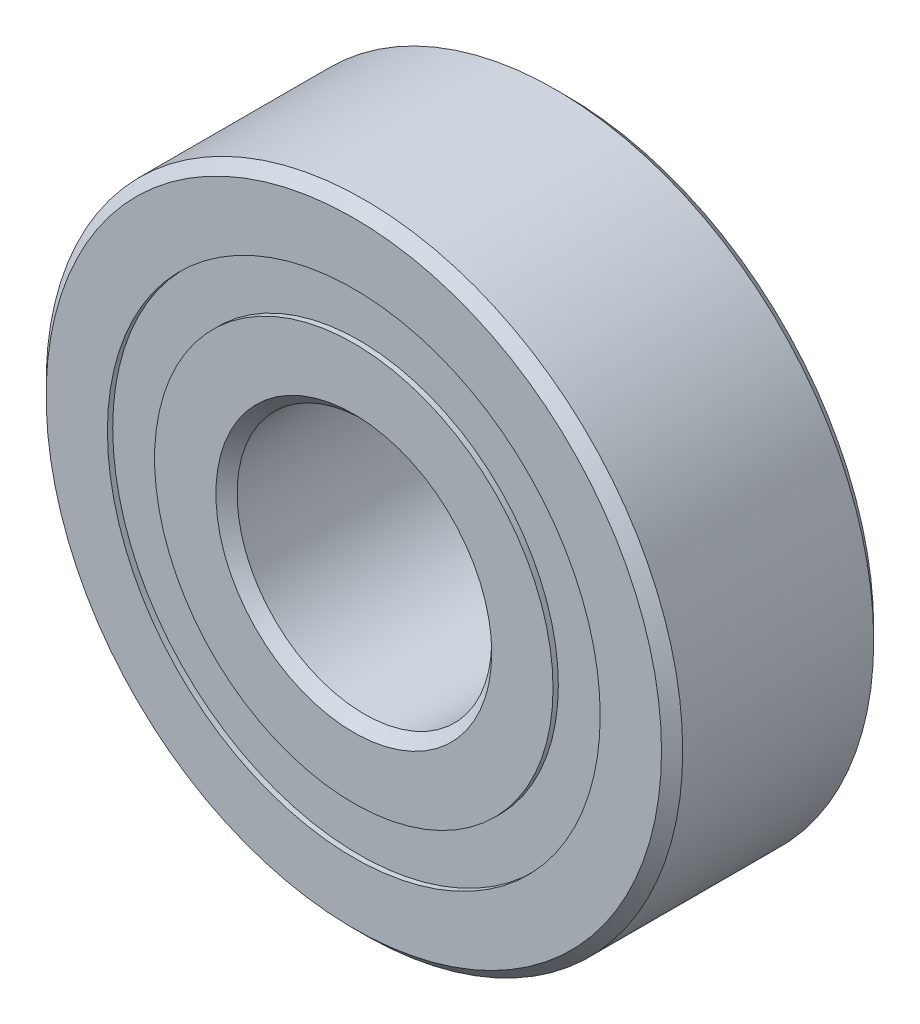
ISO-10303-21;
HEADER;
FILE_DESCRIPTION(('STEP AP214'),'2;1');
FILE_NAME('part.step','',(''),(''),'','','');
FILE_SCHEMA(('AUTOMOTIVE_DESIGN { 1 0 10303 214 1 1 1 1 }'));
ENDSEC;
DATA;
#1=APPLICATION_CONTEXT('core data for automotive mechanical design processes');
#2=APPLICATION_PROTOCOL_DEFINITION('international standard','automotive_design',2000,#1);
#3=PRODUCT_CONTEXT('',#1,'mechanical');
#4=PRODUCT('Part','Part','',(#3));
#5=PRODUCT_RELATED_PRODUCT_CATEGORY('part','',(#4));
#6=PRODUCT_DEFINITION_FORMATION('','',#4);
#7=PRODUCT_DEFINITION_CONTEXT('part definition',#1,'design');
#8=PRODUCT_DEFINITION('design','',#6,#7);
#9=PRODUCT_DEFINITION_SHAPE('','',#8);
#10=(LENGTH_UNIT() NAMED_UNIT(*) SI_UNIT(.MILLI.,.METRE.));
#11=(NAMED_UNIT(*) PLANE_ANGLE_UNIT() SI_UNIT($,.RADIAN.));
#12=(NAMED_UNIT(*) SI_UNIT($,.STERADIAN.) SOLID_ANGLE_UNIT());
#13=UNCERTAINTY_MEASURE_WITH_UNIT(LENGTH_MEASURE(1.E-05),#10,'distance_accuracy_value','');
#14=(GEOMETRIC_REPRESENTATION_CONTEXT(3) GLOBAL_UNCERTAINTY_ASSIGNED_CONTEXT((#13)) GLOBAL_UNIT_ASSIGNED_CONTEXT((#10,
#11,#12)) REPRESENTATION_CONTEXT('',''));
#15=CARTESIAN_POINT('',(0.,0.,0.));
#16=DIRECTION('',(0.,0.,1.));
#17=DIRECTION('',(1.,0.,0.));
#18=AXIS2_PLACEMENT_3D('',#15,#16,#17);
#19=CARTESIAN_POINT('',(0.,5.80555555555555,-1.24225998749989));
#20=DIRECTION('',(0.,0.,-1.));
#21=DIRECTION('',(-1.,0.,0.));
#22=AXIS2_PLACEMENT_3D('',#19,#20,#21);
#23=PLANE('',#22);
#24=CARTESIAN_POINT('',(0.,0.,-1.24225998749989));
#25=DIRECTION('',(0.,0.,1.));
#26=DIRECTION('',(1.,0.,0.));
#27=AXIS2_PLACEMENT_3D('',#24,#25,#26);
#28=CIRCLE('',#27,4.69444444444445);
#29=CARTESIAN_POINT('',(4.69444444444445,0.,-1.24225998749989));
#30=VERTEX_POINT('',#29);
#31=EDGE_CURVE('E11',#30,#30,#28,.T.);
#32=ORIENTED_EDGE('',*,*,#31,.F.);
#33=EDGE_LOOP('',(#32));
#34=FACE_BOUND('',#33,.T.);
#35=CARTESIAN_POINT('',(0.,0.,-1.24225998749988));
#36=DIRECTION('',(0.,0.,1.));
#37=DIRECTION('',(1.,0.,0.));
#38=AXIS2_PLACEMENT_3D('',#35,#36,#37);
#39=CIRCLE('',#38,5.80555555555555);
#40=CARTESIAN_POINT('',(5.80555555555555,0.,-1.24225998749988));
#41=VERTEX_POINT('',#40);
#42=EDGE_CURVE('E58',#41,#41,#39,.T.);
#43=ORIENTED_EDGE('',*,*,#42,.T.);
#44=EDGE_LOOP('',(#43));
#45=FACE_BOUND('',#44,.T.);
#46=ADVANCED_FACE('F44',(#34,#45),#23,.F.);
#47=CARTESIAN_POINT('',(0.,0.,2.5));
#48=DIRECTION('',(0.,0.,1.));
#49=DIRECTION('',(1.,0.,0.));
#50=AXIS2_PLACEMENT_3D('',#47,#48,#49);
#51=CYLINDRICAL_SURFACE('',#50,4.69444444444445);
#52=CARTESIAN_POINT('',(0.,0.,-2.375));
#53=DIRECTION('',(0.,0.,1.));
#54=DIRECTION('',(1.,0.,0.));
#55=AXIS2_PLACEMENT_3D('',#52,#53,#54);
#56=CIRCLE('',#55,4.69444444444445);
#57=CARTESIAN_POINT('',(4.69444444444445,0.,-2.375));
#58=VERTEX_POINT('',#57);
#59=EDGE_CURVE('E50',#58,#58,#56,.T.);
#60=ORIENTED_EDGE('',*,*,#59,.F.);
#61=EDGE_LOOP('',(#60));
#62=FACE_BOUND('',#61,.T.);
#63=ORIENTED_EDGE('',*,*,#31,.T.);
#64=EDGE_LOOP('',(#63));
#65=FACE_BOUND('',#64,.T.);
#66=ADVANCED_FACE('F73',(#62,#65),#51,.F.);
#67=CARTESIAN_POINT('',(0.,5.80555555555555,-2.375));
#68=DIRECTION('',(0.,0.,1.));
#69=DIRECTION('',(1.,0.,0.));
#70=AXIS2_PLACEMENT_3D('',#67,#68,#69);
#71=PLANE('',#70);
#72=CARTESIAN_POINT('',(0.,0.,-2.375));
#73=DIRECTION('',(0.,0.,1.));
#74=DIRECTION('',(1.,0.,0.));
#75=AXIS2_PLACEMENT_3D('',#72,#73,#74);
#76=CIRCLE('',#75,5.80555555555555);
#77=CARTESIAN_POINT('',(5.80555555555555,0.,-2.375));
#78=VERTEX_POINT('',#77);
#79=EDGE_CURVE('E54',#78,#78,#76,.T.);
#80=ORIENTED_EDGE('',*,*,#79,.F.);
#81=EDGE_LOOP('',(#80));
#82=FACE_BOUND('',#81,.T.);
#83=ORIENTED_EDGE('',*,*,#59,.T.);
#84=EDGE_LOOP('',(#83));
#85=FACE_BOUND('',#84,.T.);
#86=ADVANCED_FACE('F68',(#82,#85),#71,.F.);
#87=CARTESIAN_POINT('',(0.,0.,2.5));
#88=DIRECTION('',(0.,0.,1.));
#89=DIRECTION('',(1.,0.,0.));
#90=AXIS2_PLACEMENT_3D('',#87,#88,#89);
#91=CYLINDRICAL_SURFACE('',#90,5.80555555555555);
#92=ORIENTED_EDGE('',*,*,#42,.F.);
#93=EDGE_LOOP('',(#92));
#94=FACE_BOUND('',#93,.T.);
#95=ORIENTED_EDGE('',*,*,#79,.T.);
#96=EDGE_LOOP('',(#95));
#97=FACE_BOUND('',#96,.T.);
#98=ADVANCED_FACE('F65',(#94,#97),#91,.T.);
#99=CLOSED_SHELL('',(#46,#66,#86,#98));
#100=MANIFOLD_SOLID_BREP('B2',#99);
#101=CARTESIAN_POINT('',(0.,5.80555555555555,2.375));
#102=DIRECTION('',(0.,0.,-1.));
#103=DIRECTION('',(-1.,0.,0.));
#104=AXIS2_PLACEMENT_3D('',#101,#102,#103);
#105=PLANE('',#104);
#106=CARTESIAN_POINT('',(0.,0.,2.375));
#107=DIRECTION('',(0.,0.,1.));
#108=DIRECTION('',(1.,0.,0.));
#109=AXIS2_PLACEMENT_3D('',#106,#107,#108);
#110=CIRCLE('',#109,4.69444444444445);
#111=CARTESIAN_POINT('',(4.69444444444445,0.,2.375));
#112=VERTEX_POINT('',#111);
#113=EDGE_CURVE('E43',#112,#112,#110,.T.);
#114=ORIENTED_EDGE('',*,*,#113,.F.);
#115=EDGE_LOOP('',(#114));
#116=FACE_BOUND('',#115,.T.);
#117=CARTESIAN_POINT('',(0.,0.,2.375));
#118=DIRECTION('',(0.,0.,1.));
#119=DIRECTION('',(1.,0.,0.));
#120=AXIS2_PLACEMENT_3D('',#117,#118,#119);
#121=CIRCLE('',#120,5.80555555555555);
#122=CARTESIAN_POINT('',(5.80555555555555,0.,2.375));
#123=VERTEX_POINT('',#122);
#124=EDGE_CURVE('E126',#123,#123,#121,.T.);
#125=ORIENTED_EDGE('',*,*,#124,.T.);
#126=EDGE_LOOP('',(#125));
#127=FACE_BOUND('',#126,.T.);
#128=ADVANCED_FACE('F112',(#116,#127),#105,.F.);
#129=CARTESIAN_POINT('',(0.,0.,2.5));
#130=DIRECTION('',(0.,0.,1.));
#131=DIRECTION('',(1.,0.,0.));
#132=AXIS2_PLACEMENT_3D('',#129,#130,#131);
#133=CYLINDRICAL_SURFACE('',#132,4.69444444444445);
#134=CARTESIAN_POINT('',(0.,0.,1.24225998749988));
#135=DIRECTION('',(0.,0.,1.));
#136=DIRECTION('',(1.,0.,0.));
#137=AXIS2_PLACEMENT_3D('',#134,#135,#136);
#138=CIRCLE('',#137,4.69444444444445);
#139=CARTESIAN_POINT('',(4.69444444444445,0.,1.24225998749988));
#140=VERTEX_POINT('',#139);
#141=EDGE_CURVE('E118',#140,#140,#138,.T.);
#142=ORIENTED_EDGE('',*,*,#141,.F.);
#143=EDGE_LOOP('',(#142));
#144=FACE_BOUND('',#143,.T.);
#145=ORIENTED_EDGE('',*,*,#113,.T.);
#146=EDGE_LOOP('',(#145));
#147=FACE_BOUND('',#146,.T.);
#148=ADVANCED_FACE('F141',(#144,#147),#133,.F.);
#149=CARTESIAN_POINT('',(0.,5.80555555555555,1.24225998749988));
#150=DIRECTION('',(0.,0.,1.));
#151=DIRECTION('',(1.,0.,0.));
#152=AXIS2_PLACEMENT_3D('',#149,#150,#151);
#153=PLANE('',#152);
#154=CARTESIAN_POINT('',(0.,0.,1.24225998749988));
#155=DIRECTION('',(0.,0.,1.));
#156=DIRECTION('',(1.,0.,0.));
#157=AXIS2_PLACEMENT_3D('',#154,#155,#156);
#158=CIRCLE('',#157,5.80555555555555);
#159=CARTESIAN_POINT('',(5.80555555555555,0.,1.24225998749988));
#160=VERTEX_POINT('',#159);
#161=EDGE_CURVE('E122',#160,#160,#158,.T.);
#162=ORIENTED_EDGE('',*,*,#161,.F.);
#163=EDGE_LOOP('',(#162));
#164=FACE_BOUND('',#163,.T.);
#165=ORIENTED_EDGE('',*,*,#141,.T.);
#166=EDGE_LOOP('',(#165));
#167=FACE_BOUND('',#166,.T.);
#168=ADVANCED_FACE('F136',(#164,#167),#153,.F.);
#169=CARTESIAN_POINT('',(0.,0.,2.5));
#170=DIRECTION('',(0.,0.,1.));
#171=DIRECTION('',(1.,0.,0.));
#172=AXIS2_PLACEMENT_3D('',#169,#170,#171);
#173=CYLINDRICAL_SURFACE('',#172,5.80555555555555);
#174=ORIENTED_EDGE('',*,*,#124,.F.);
#175=EDGE_LOOP('',(#174));
#176=FACE_BOUND('',#175,.T.);
#177=ORIENTED_EDGE('',*,*,#161,.T.);
#178=EDGE_LOOP('',(#177));
#179=FACE_BOUND('',#178,.T.);
#180=ADVANCED_FACE('F133',(#176,#179),#173,.T.);
#181=CLOSED_SHELL('',(#128,#148,#168,#180));
#182=MANIFOLD_SOLID_BREP('B6',#181);
#183=CARTESIAN_POINT('',(-2.62499999999994,4.54663336986834,0.));
#184=DIRECTION('',(0.,0.,1.));
#185=DIRECTION('',(-0.499999999999989,0.866025403784445,0.));
#186=AXIS2_PLACEMENT_3D('',#183,#184,#185);
#187=SPHERICAL_SURFACE('',#186,1.24225998749988);
#188=CARTESIAN_POINT('',(-2.62499999999994,4.54663336986834,1.24225998749987));
#189=VERTEX_POINT('',#188);
#190=VERTEX_LOOP('',#189);
#191=FACE_BOUND('',#190,.T.);
#192=ADVANCED_FACE('F180',(#191),#187,.T.);
#193=CLOSED_SHELL('',(#192));
#194=MANIFOLD_SOLID_BREP('B38',#193);
#195=CARTESIAN_POINT('',(-4.54663336986827,2.62500000000005,0.));
#196=DIRECTION('',(0.,0.,1.));
#197=DIRECTION('',(-0.866025403784433,0.50000000000001,0.));
#198=AXIS2_PLACEMENT_3D('',#195,#196,#197);
#199=SPHERICAL_SURFACE('',#198,1.24225998749988);
#200=CARTESIAN_POINT('',(-4.54663336986827,2.62500000000005,1.24225998749987));
#201=VERTEX_POINT('',#200);
#202=VERTEX_LOOP('',#201);
#203=FACE_BOUND('',#202,.T.);
#204=ADVANCED_FACE('F213',(#203),#199,.T.);
#205=CLOSED_SHELL('',(#204));
#206=MANIFOLD_SOLID_BREP('B108',#205);
#207=CARTESIAN_POINT('',(-5.25,0.,0.));
#208=DIRECTION('',(0.,0.,1.));
#209=DIRECTION('',(-1.,0.,0.));
#210=AXIS2_PLACEMENT_3D('',#207,#208,#209);
#211=SPHERICAL_SURFACE('',#210,1.24225998749988);
#212=CARTESIAN_POINT('',(-5.25,0.,1.24225998749987));
#213=VERTEX_POINT('',#212);
#214=VERTEX_LOOP('',#213);
#215=FACE_BOUND('',#214,.T.);
#216=ADVANCED_FACE('F246',(#215),#211,.T.);
#217=CLOSED_SHELL('',(#216));
#218=MANIFOLD_SOLID_BREP('B176',#217);
#219=CARTESIAN_POINT('',(-4.54663336986833,-2.62499999999996,0.));
#220=DIRECTION('',(0.,0.,1.));
#221=DIRECTION('',(-0.866025403784443,-0.499999999999992,0.));
#222=AXIS2_PLACEMENT_3D('',#219,#220,#221);
#223=SPHERICAL_SURFACE('',#222,1.24225998749988);
#224=CARTESIAN_POINT('',(-4.54663336986833,-2.62499999999996,1.24225998749987));
#225=VERTEX_POINT('',#224);
#226=VERTEX_LOOP('',#225);
#227=FACE_BOUND('',#226,.T.);
#228=ADVANCED_FACE('F279',(#227),#223,.T.);
#229=CLOSED_SHELL('',(#228));
#230=MANIFOLD_SOLID_BREP('B209',#229);
#231=CARTESIAN_POINT('',(-2.62500000000004,-4.54663336986828,0.));
#232=DIRECTION('',(0.,0.,1.));
#233=DIRECTION('',(-0.500000000000007,-0.866025403784435,0.));
#234=AXIS2_PLACEMENT_3D('',#231,#232,#233);
#235=SPHERICAL_SURFACE('',#234,1.24225998749988);
#236=CARTESIAN_POINT('',(-2.62500000000004,-4.54663336986828,1.24225998749987));
#237=VERTEX_POINT('',#236);
#238=VERTEX_LOOP('',#237);
#239=FACE_BOUND('',#238,.T.);
#240=ADVANCED_FACE('F312',(#239),#235,.T.);
#241=CLOSED_SHELL('',(#240));
#242=MANIFOLD_SOLID_BREP('B242',#241);
#243=CARTESIAN_POINT('',(0.,-5.25,0.));
#244=DIRECTION('',(0.,0.,1.));
#245=DIRECTION('',(0.,-1.,0.));
#246=AXIS2_PLACEMENT_3D('',#243,#244,#245);
#247=SPHERICAL_SURFACE('',#246,1.24225998749988);
#248=CARTESIAN_POINT('',(0.,-5.25,1.24225998749987));
#249=VERTEX_POINT('',#248);
#250=VERTEX_LOOP('',#249);
#251=FACE_BOUND('',#250,.T.);
#252=ADVANCED_FACE('F345',(#251),#247,.T.);
#253=CLOSED_SHELL('',(#252));
#254=MANIFOLD_SOLID_BREP('B275',#253);
#255=CARTESIAN_POINT('',(2.62499999999997,-4.54663336986832,0.));
#256=DIRECTION('',(0.,0.,1.));
#257=DIRECTION('',(0.499999999999995,-0.866025403784442,0.));
#258=AXIS2_PLACEMENT_3D('',#255,#256,#257);
#259=SPHERICAL_SURFACE('',#258,1.24225998749988);
#260=CARTESIAN_POINT('',(2.62499999999997,-4.54663336986832,1.24225998749987));
#261=VERTEX_POINT('',#260);
#262=VERTEX_LOOP('',#261);
#263=FACE_BOUND('',#262,.T.);
#264=ADVANCED_FACE('F378',(#263),#259,.T.);
#265=CLOSED_SHELL('',(#264));
#266=MANIFOLD_SOLID_BREP('B308',#265);
#267=CARTESIAN_POINT('',(4.54663336986829,-2.62500000000002,0.));
#268=DIRECTION('',(0.,0.,1.));
#269=DIRECTION('',(0.866025403784436,-0.500000000000004,0.));
#270=AXIS2_PLACEMENT_3D('',#267,#268,#269);
#271=SPHERICAL_SURFACE('',#270,1.24225998749988);
#272=CARTESIAN_POINT('',(4.54663336986829,-2.62500000000002,1.24225998749987));
#273=VERTEX_POINT('',#272);
#274=VERTEX_LOOP('',#273);
#275=FACE_BOUND('',#274,.T.);
#276=ADVANCED_FACE('F411',(#275),#271,.T.);
#277=CLOSED_SHELL('',(#276));
#278=MANIFOLD_SOLID_BREP('B341',#277);
#279=CARTESIAN_POINT('',(5.25,0.,0.));
#280=DIRECTION('',(0.,0.,1.));
#281=DIRECTION('',(1.,0.,0.));
#282=AXIS2_PLACEMENT_3D('',#279,#280,#281);
#283=SPHERICAL_SURFACE('',#282,1.24225998749988);
#284=CARTESIAN_POINT('',(5.25,0.,1.24225998749987));
#285=VERTEX_POINT('',#284);
#286=VERTEX_LOOP('',#285);
#287=FACE_BOUND('',#286,.T.);
#288=ADVANCED_FACE('F444',(#287),#283,.T.);
#289=CLOSED_SHELL('',(#288));
#290=MANIFOLD_SOLID_BREP('B374',#289);
#291=CARTESIAN_POINT('',(4.54663336986831,2.62499999999999,0.));
#292=DIRECTION('',(0.,0.,1.));
#293=DIRECTION('',(0.86602540378444,0.499999999999998,0.));
#294=AXIS2_PLACEMENT_3D('',#291,#292,#293);
#295=SPHERICAL_SURFACE('',#294,1.24225998749988);
#296=CARTESIAN_POINT('',(4.54663336986831,2.62499999999999,1.24225998749987));
#297=VERTEX_POINT('',#296);
#298=VERTEX_LOOP('',#297);
#299=FACE_BOUND('',#298,.T.);
#300=ADVANCED_FACE('F477',(#299),#295,.T.);
#301=CLOSED_SHELL('',(#300));
#302=MANIFOLD_SOLID_BREP('B407',#301);
#303=CARTESIAN_POINT('',(2.62500000000001,4.5466333698683,0.));
#304=DIRECTION('',(0.,0.,1.));
#305=DIRECTION('',(0.500000000000001,0.866025403784438,0.));
#306=AXIS2_PLACEMENT_3D('',#303,#304,#305);
#307=SPHERICAL_SURFACE('',#306,1.24225998749988);
#308=CARTESIAN_POINT('',(2.62500000000001,4.5466333698683,1.24225998749987));
#309=VERTEX_POINT('',#308);
#310=VERTEX_LOOP('',#309);
#311=FACE_BOUND('',#310,.T.);
#312=ADVANCED_FACE('F510',(#311),#307,.T.);
#313=CLOSED_SHELL('',(#312));
#314=MANIFOLD_SOLID_BREP('B440',#313);
#315=CARTESIAN_POINT('',(0.,5.25,0.));
#316=DIRECTION('',(0.,0.,1.));
#317=DIRECTION('',(0.,1.,0.));
#318=AXIS2_PLACEMENT_3D('',#315,#316,#317);
#319=SPHERICAL_SURFACE('',#318,1.24225998749988);
#320=CARTESIAN_POINT('',(0.,5.25,1.24225998749987));
#321=VERTEX_POINT('',#320);
#322=VERTEX_LOOP('',#321);
#323=FACE_BOUND('',#322,.T.);
#324=ADVANCED_FACE('F545',(#323),#319,.T.);
#325=CLOSED_SHELL('',(#324));
#326=MANIFOLD_SOLID_BREP('B473',#325);
#327=CARTESIAN_POINT('',(0.,4.69444444444445,2.5));
#328=DIRECTION('',(0.,0.,-1.));
#329=DIRECTION('',(-1.,0.,0.));
#330=AXIS2_PLACEMENT_3D('',#327,#328,#329);
#331=PLANE('',#330);
#332=CARTESIAN_POINT('',(0.,0.,2.5));
#333=DIRECTION('',(0.,0.,1.));
#334=DIRECTION('',(1.,0.,0.));
#335=AXIS2_PLACEMENT_3D('',#332,#333,#334);
#336=CIRCLE('',#335,3.25);
#337=CARTESIAN_POINT('',(3.25,0.,2.5));
#338=VERTEX_POINT('',#337);
#339=EDGE_CURVE('E544',#338,#338,#336,.T.);
#340=ORIENTED_EDGE('',*,*,#339,.F.);
#341=EDGE_LOOP('',(#340));
#342=FACE_BOUND('',#341,.T.);
#343=CARTESIAN_POINT('',(0.,0.,2.5));
#344=DIRECTION('',(0.,0.,1.));
#345=DIRECTION('',(1.,0.,0.));
#346=AXIS2_PLACEMENT_3D('',#343,#344,#345);
#347=CIRCLE('',#346,4.69444444444445);
#348=CARTESIAN_POINT('',(4.69444444444445,0.,2.5));
#349=VERTEX_POINT('',#348);
#350=EDGE_CURVE('E593',#349,#349,#347,.T.);
#351=ORIENTED_EDGE('',*,*,#350,.T.);
#352=EDGE_LOOP('',(#351));
#353=FACE_BOUND('',#352,.T.);
#354=ADVANCED_FACE('F565',(#342,#353),#331,.F.);
#355=CARTESIAN_POINT('',(0.,0.,2.5));
#356=DIRECTION('',(0.,0.,1.));
#357=DIRECTION('',(1.,0.,0.));
#358=AXIS2_PLACEMENT_3D('',#355,#356,#357);
#359=CONICAL_SURFACE('',#358,3.25,0.785398163397445);
#360=CARTESIAN_POINT('',(0.,0.,2.25));
#361=DIRECTION('',(0.,0.,1.));
#362=DIRECTION('',(1.,0.,0.));
#363=AXIS2_PLACEMENT_3D('',#360,#361,#362);
#364=CIRCLE('',#363,3.);
#365=CARTESIAN_POINT('',(3.,0.,2.25));
#366=VERTEX_POINT('',#365);
#367=EDGE_CURVE('E571',#366,#366,#364,.T.);
#368=ORIENTED_EDGE('',*,*,#367,.F.);
#369=EDGE_LOOP('',(#368));
#370=FACE_BOUND('',#369,.T.);
#371=ORIENTED_EDGE('',*,*,#339,.T.);
#372=EDGE_LOOP('',(#371));
#373=FACE_BOUND('',#372,.T.);
#374=ADVANCED_FACE('F630',(#370,#373),#359,.F.);
#375=CARTESIAN_POINT('',(0.,0.,2.5));
#376=DIRECTION('',(0.,0.,1.));
#377=DIRECTION('',(1.,0.,0.));
#378=AXIS2_PLACEMENT_3D('',#375,#376,#377);
#379=CYLINDRICAL_SURFACE('',#378,3.);
#380=CARTESIAN_POINT('',(0.,0.,-2.25));
#381=DIRECTION('',(0.,0.,1.));
#382=DIRECTION('',(1.,0.,0.));
#383=AXIS2_PLACEMENT_3D('',#380,#381,#382);
#384=CIRCLE('',#383,3.);
#385=CARTESIAN_POINT('',(3.,0.,-2.25));
#386=VERTEX_POINT('',#385);
#387=EDGE_CURVE('E575',#386,#386,#384,.T.);
#388=ORIENTED_EDGE('',*,*,#387,.F.);
#389=EDGE_LOOP('',(#388));
#390=FACE_BOUND('',#389,.T.);
#391=ORIENTED_EDGE('',*,*,#367,.T.);
#392=EDGE_LOOP('',(#391));
#393=FACE_BOUND('',#392,.T.);
#394=ADVANCED_FACE('F625',(#390,#393),#379,.F.);
#395=CARTESIAN_POINT('',(0.,0.,-2.25));
#396=DIRECTION('',(0.,0.,-1.));
#397=DIRECTION('',(-1.,0.,0.));
#398=AXIS2_PLACEMENT_3D('',#395,#396,#397);
#399=CONICAL_SURFACE('',#398,3.,0.785398163397445);
#400=CARTESIAN_POINT('',(0.,0.,-2.5));
#401=DIRECTION('',(0.,0.,1.));
#402=DIRECTION('',(1.,0.,0.));
#403=AXIS2_PLACEMENT_3D('',#400,#401,#402);
#404=CIRCLE('',#403,3.25);
#405=CARTESIAN_POINT('',(3.25,0.,-2.5));
#406=VERTEX_POINT('',#405);
#407=EDGE_CURVE('E579',#406,#406,#404,.T.);
#408=ORIENTED_EDGE('',*,*,#407,.F.);
#409=EDGE_LOOP('',(#408));
#410=FACE_BOUND('',#409,.T.);
#411=ORIENTED_EDGE('',*,*,#387,.T.);
#412=EDGE_LOOP('',(#411));
#413=FACE_BOUND('',#412,.T.);
#414=ADVANCED_FACE('F619',(#410,#413),#399,.F.);
#415=CARTESIAN_POINT('',(0.,4.69444444444445,-2.5));
#416=DIRECTION('',(0.,0.,1.));
#417=DIRECTION('',(1.,0.,0.));
#418=AXIS2_PLACEMENT_3D('',#415,#416,#417);
#419=PLANE('',#418);
#420=CARTESIAN_POINT('',(0.,0.,-2.50000000000001));
#421=DIRECTION('',(0.,0.,1.));
#422=DIRECTION('',(1.,0.,0.));
#423=AXIS2_PLACEMENT_3D('',#420,#421,#422);
#424=CIRCLE('',#423,4.69444444444445);
#425=CARTESIAN_POINT('',(4.69444444444445,0.,-2.50000000000001));
#426=VERTEX_POINT('',#425);
#427=EDGE_CURVE('E584',#426,#426,#424,.T.);
#428=ORIENTED_EDGE('',*,*,#427,.F.);
#429=EDGE_LOOP('',(#428));
#430=FACE_BOUND('',#429,.T.);
#431=ORIENTED_EDGE('',*,*,#407,.T.);
#432=EDGE_LOOP('',(#431));
#433=FACE_BOUND('',#432,.T.);
#434=ADVANCED_FACE('F613',(#430,#433),#419,.F.);
#435=CARTESIAN_POINT('',(0.,0.,2.5));
#436=DIRECTION('',(0.,0.,1.));
#437=DIRECTION('',(1.,0.,0.));
#438=AXIS2_PLACEMENT_3D('',#435,#436,#437);
#439=CYLINDRICAL_SURFACE('',#438,4.69444444444445);
#440=CARTESIAN_POINT('',(0.,0.,-1.11111111111111));
#441=DIRECTION('',(0.,0.,1.));
#442=DIRECTION('',(1.,0.,0.));
#443=AXIS2_PLACEMENT_3D('',#440,#441,#442);
#444=CIRCLE('',#443,4.69444444444445);
#445=CARTESIAN_POINT('',(4.69444444444445,0.,-1.11111111111111));
#446=VERTEX_POINT('',#445);
#447=EDGE_CURVE('E587',#446,#446,#444,.T.);
#448=ORIENTED_EDGE('',*,*,#447,.F.);
#449=EDGE_LOOP('',(#448));
#450=FACE_BOUND('',#449,.T.);
#451=ORIENTED_EDGE('',*,*,#427,.T.);
#452=EDGE_LOOP('',(#451));
#453=FACE_BOUND('',#452,.T.);
#454=ADVANCED_FACE('F607',(#450,#453),#439,.T.);
#455=CARTESIAN_POINT('',(0.,0.,0.));
#456=DIRECTION('',(0.,0.,1.));
#457=DIRECTION('',(1.,0.,0.));
#458=AXIS2_PLACEMENT_3D('',#455,#456,#457);
#459=TOROIDAL_SURFACE('',#458,5.25,1.24225998749988);
#460=CARTESIAN_POINT('',(0.,0.,1.11111111111111));
#461=DIRECTION('',(0.,0.,1.));
#462=DIRECTION('',(1.,0.,0.));
#463=AXIS2_PLACEMENT_3D('',#460,#461,#462);
#464=CIRCLE('',#463,4.69444444444445);
#465=CARTESIAN_POINT('',(4.69444444444445,0.,1.11111111111111));
#466=VERTEX_POINT('',#465);
#467=EDGE_CURVE('E590',#466,#466,#464,.T.);
#468=ORIENTED_EDGE('',*,*,#467,.F.);
#469=EDGE_LOOP('',(#468));
#470=FACE_BOUND('',#469,.T.);
#471=ORIENTED_EDGE('',*,*,#447,.T.);
#472=EDGE_LOOP('',(#471));
#473=FACE_BOUND('',#472,.T.);
#474=ADVANCED_FACE('F601',(#470,#473),#459,.F.);
#475=CARTESIAN_POINT('',(0.,0.,2.5));
#476=DIRECTION('',(0.,0.,1.));
#477=DIRECTION('',(1.,0.,0.));
#478=AXIS2_PLACEMENT_3D('',#475,#476,#477);
#479=CYLINDRICAL_SURFACE('',#478,4.69444444444445);
#480=ORIENTED_EDGE('',*,*,#350,.F.);
#481=EDGE_LOOP('',(#480));
#482=FACE_BOUND('',#481,.T.);
#483=ORIENTED_EDGE('',*,*,#467,.T.);
#484=EDGE_LOOP('',(#483));
#485=FACE_BOUND('',#484,.T.);
#486=ADVANCED_FACE('F598',(#482,#485),#479,.T.);
#487=CLOSED_SHELL('',(#354,#374,#394,#414,#434,#454,#474,#486));
#488=MANIFOLD_SOLID_BREP('B506',#487);
#489=CARTESIAN_POINT('',(0.,0.,2.25));
#490=DIRECTION('',(0.,0.,-1.));
#491=DIRECTION('',(-1.,0.,0.));
#492=AXIS2_PLACEMENT_3D('',#489,#490,#491);
#493=CONICAL_SURFACE('',#492,7.5,0.785398163397448);
#494=CARTESIAN_POINT('',(0.,0.,2.5));
#495=DIRECTION('',(0.,0.,1.));
#496=DIRECTION('',(1.,0.,0.));
#497=AXIS2_PLACEMENT_3D('',#494,#495,#496);
#498=CIRCLE('',#497,7.25);
#499=CARTESIAN_POINT('',(7.25,0.,2.5));
#500=VERTEX_POINT('',#499);
#501=EDGE_CURVE('E715',#500,#500,#498,.T.);
#502=ORIENTED_EDGE('',*,*,#501,.F.);
#503=EDGE_LOOP('',(#502));
#504=FACE_BOUND('',#503,.T.);
#505=CARTESIAN_POINT('',(0.,0.,2.25));
#506=DIRECTION('',(0.,0.,1.));
#507=DIRECTION('',(1.,0.,0.));
#508=AXIS2_PLACEMENT_3D('',#505,#506,#507);
#509=CIRCLE('',#508,7.5);
#510=CARTESIAN_POINT('',(7.5,0.,2.25));
#511=VERTEX_POINT('',#510);
#512=EDGE_CURVE('E564',#511,#511,#509,.T.);
#513=ORIENTED_EDGE('',*,*,#512,.T.);
#514=EDGE_LOOP('',(#513));
#515=FACE_BOUND('',#514,.T.);
#516=ADVANCED_FACE('F687',(#504,#515),#493,.T.);
#517=CARTESIAN_POINT('',(0.,0.,2.5));
#518=DIRECTION('',(0.,0.,1.));
#519=DIRECTION('',(1.,0.,0.));
#520=AXIS2_PLACEMENT_3D('',#517,#518,#519);
#521=CYLINDRICAL_SURFACE('',#520,7.5);
#522=ORIENTED_EDGE('',*,*,#512,.F.);
#523=EDGE_LOOP('',(#522));
#524=FACE_BOUND('',#523,.T.);
#525=CARTESIAN_POINT('',(0.,0.,-2.25000000000001));
#526=DIRECTION('',(0.,0.,1.));
#527=DIRECTION('',(1.,0.,0.));
#528=AXIS2_PLACEMENT_3D('',#525,#526,#527);
#529=CIRCLE('',#528,7.5);
#530=CARTESIAN_POINT('',(7.5,0.,-2.25000000000001));
#531=VERTEX_POINT('',#530);
#532=EDGE_CURVE('E693',#531,#531,#529,.T.);
#533=ORIENTED_EDGE('',*,*,#532,.T.);
#534=EDGE_LOOP('',(#533));
#535=FACE_BOUND('',#534,.T.);
#536=ADVANCED_FACE('F722',(#524,#535),#521,.T.);
#537=CARTESIAN_POINT('',(0.,0.,-2.50000000000001));
#538=DIRECTION('',(0.,0.,1.));
#539=DIRECTION('',(1.,0.,0.));
#540=AXIS2_PLACEMENT_3D('',#537,#538,#539);
#541=CONICAL_SURFACE('',#540,7.25,0.785398163397448);
#542=ORIENTED_EDGE('',*,*,#532,.F.);
#543=EDGE_LOOP('',(#542));
#544=FACE_BOUND('',#543,.T.);
#545=CARTESIAN_POINT('',(0.,0.,-2.50000000000001));
#546=DIRECTION('',(0.,0.,1.));
#547=DIRECTION('',(1.,0.,0.));
#548=AXIS2_PLACEMENT_3D('',#545,#546,#547);
#549=CIRCLE('',#548,7.25);
#550=CARTESIAN_POINT('',(7.25,0.,-2.50000000000001));
#551=VERTEX_POINT('',#550);
#552=EDGE_CURVE('E697',#551,#551,#549,.T.);
#553=ORIENTED_EDGE('',*,*,#552,.T.);
#554=EDGE_LOOP('',(#553));
#555=FACE_BOUND('',#554,.T.);
#556=ADVANCED_FACE('F726',(#544,#555),#541,.T.);
#557=CARTESIAN_POINT('',(0.,7.25,-2.50000000000001));
#558=DIRECTION('',(0.,0.,1.));
#559=DIRECTION('',(1.,0.,0.));
#560=AXIS2_PLACEMENT_3D('',#557,#558,#559);
#561=PLANE('',#560);
#562=ORIENTED_EDGE('',*,*,#552,.F.);
#563=EDGE_LOOP('',(#562));
#564=FACE_BOUND('',#563,.T.);
#565=CARTESIAN_POINT('',(0.,0.,-2.50000000000001));
#566=DIRECTION('',(0.,0.,1.));
#567=DIRECTION('',(1.,0.,0.));
#568=AXIS2_PLACEMENT_3D('',#565,#566,#567);
#569=CIRCLE('',#568,5.80555555555555);
#570=CARTESIAN_POINT('',(5.80555555555555,0.,-2.50000000000001));
#571=VERTEX_POINT('',#570);
#572=EDGE_CURVE('E701',#571,#571,#569,.T.);
#573=ORIENTED_EDGE('',*,*,#572,.T.);
#574=EDGE_LOOP('',(#573));
#575=FACE_BOUND('',#574,.T.);
#576=ADVANCED_FACE('F731',(#564,#575),#561,.F.);
#577=CARTESIAN_POINT('',(0.,0.,2.5));
#578=DIRECTION('',(0.,0.,1.));
#579=DIRECTION('',(1.,0.,0.));
#580=AXIS2_PLACEMENT_3D('',#577,#578,#579);
#581=CYLINDRICAL_SURFACE('',#580,5.80555555555555);
#582=ORIENTED_EDGE('',*,*,#572,.F.);
#583=EDGE_LOOP('',(#582));
#584=FACE_BOUND('',#583,.T.);
#585=CARTESIAN_POINT('',(0.,0.,-1.11111111111111));
#586=DIRECTION('',(0.,0.,1.));
#587=DIRECTION('',(1.,0.,0.));
#588=AXIS2_PLACEMENT_3D('',#585,#586,#587);
#589=CIRCLE('',#588,5.80555555555555);
#590=CARTESIAN_POINT('',(5.80555555555555,0.,-1.11111111111111));
#591=VERTEX_POINT('',#590);
#592=EDGE_CURVE('E706',#591,#591,#589,.T.);
#593=ORIENTED_EDGE('',*,*,#592,.T.);
#594=EDGE_LOOP('',(#593));
#595=FACE_BOUND('',#594,.T.);
#596=ADVANCED_FACE('F737',(#584,#595),#581,.F.);
#597=CARTESIAN_POINT('',(0.,0.,0.));
#598=DIRECTION('',(0.,0.,1.));
#599=DIRECTION('',(1.,0.,0.));
#600=AXIS2_PLACEMENT_3D('',#597,#598,#599);
#601=TOROIDAL_SURFACE('',#600,5.25,1.24225998749988);
#602=ORIENTED_EDGE('',*,*,#592,.F.);
#603=EDGE_LOOP('',(#602));
#604=FACE_BOUND('',#603,.T.);
#605=CARTESIAN_POINT('',(0.,0.,1.11111111111111));
#606=DIRECTION('',(0.,0.,1.));
#607=DIRECTION('',(1.,0.,0.));
#608=AXIS2_PLACEMENT_3D('',#605,#606,#607);
#609=CIRCLE('',#608,5.80555555555555);
#610=CARTESIAN_POINT('',(5.80555555555555,0.,1.11111111111111));
#611=VERTEX_POINT('',#610);
#612=EDGE_CURVE('E709',#611,#611,#609,.T.);
#613=ORIENTED_EDGE('',*,*,#612,.T.);
#614=EDGE_LOOP('',(#613));
#615=FACE_BOUND('',#614,.T.);
#616=ADVANCED_FACE('F741',(#604,#615),#601,.F.);
#617=CARTESIAN_POINT('',(0.,0.,2.5));
#618=DIRECTION('',(0.,0.,1.));
#619=DIRECTION('',(1.,0.,0.));
#620=AXIS2_PLACEMENT_3D('',#617,#618,#619);
#621=CYLINDRICAL_SURFACE('',#620,5.80555555555555);
#622=ORIENTED_EDGE('',*,*,#612,.F.);
#623=EDGE_LOOP('',(#622));
#624=FACE_BOUND('',#623,.T.);
#625=CARTESIAN_POINT('',(0.,0.,2.5));
#626=DIRECTION('',(0.,0.,1.));
#627=DIRECTION('',(1.,0.,0.));
#628=AXIS2_PLACEMENT_3D('',#625,#626,#627);
#629=CIRCLE('',#628,5.80555555555555);
#630=CARTESIAN_POINT('',(5.80555555555555,0.,2.5));
#631=VERTEX_POINT('',#630);
#632=EDGE_CURVE('E712',#631,#631,#629,.T.);
#633=ORIENTED_EDGE('',*,*,#632,.T.);
#634=EDGE_LOOP('',(#633));
#635=FACE_BOUND('',#634,.T.);
#636=ADVANCED_FACE('F745',(#624,#635),#621,.F.);
#637=CARTESIAN_POINT('',(0.,7.25,2.5));
#638=DIRECTION('',(0.,0.,-1.));
#639=DIRECTION('',(-1.,0.,0.));
#640=AXIS2_PLACEMENT_3D('',#637,#638,#639);
#641=PLANE('',#640);
#642=ORIENTED_EDGE('',*,*,#632,.F.);
#643=EDGE_LOOP('',(#642));
#644=FACE_BOUND('',#643,.T.);
#645=ORIENTED_EDGE('',*,*,#501,.T.);
#646=EDGE_LOOP('',(#645));
#647=FACE_BOUND('',#646,.T.);
#648=ADVANCED_FACE('F719',(#644,#647),#641,.F.);
#649=CLOSED_SHELL('',(#516,#536,#556,#576,#596,#616,#636,#648));
#650=MANIFOLD_SOLID_BREP('B539',#649);
#651=ADVANCED_BREP_SHAPE_REPRESENTATION('',(#18,#100,#182,#194,#206,#218,#230,#242,#254,#266,
#278,#290,#302,#314,#326,#488,#650),#14);
#652=SHAPE_DEFINITION_REPRESENTATION(#9,#651);
ENDSEC;
END-ISO-10303-21;
